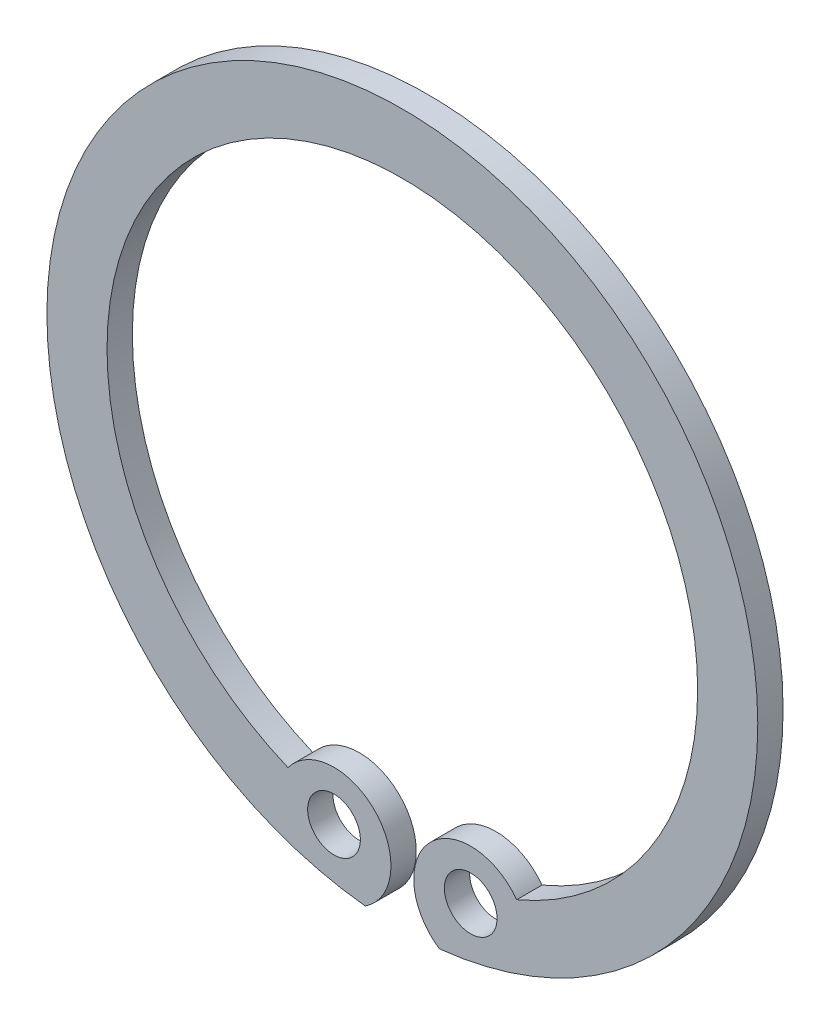
ISO-10303-21;
HEADER;
FILE_DESCRIPTION(('STEP AP214'),'2;1');
FILE_NAME('part.step','',(''),(''),'','','');
FILE_SCHEMA(('AUTOMOTIVE_DESIGN { 1 0 10303 214 1 1 1 1 }'));
ENDSEC;
DATA;
#1=APPLICATION_CONTEXT('core data for automotive mechanical design processes');
#2=APPLICATION_PROTOCOL_DEFINITION('international standard','automotive_design',2000,#1);
#3=PRODUCT_CONTEXT('',#1,'mechanical');
#4=PRODUCT('Part','Part','',(#3));
#5=PRODUCT_RELATED_PRODUCT_CATEGORY('part','',(#4));
#6=PRODUCT_DEFINITION_FORMATION('','',#4);
#7=PRODUCT_DEFINITION_CONTEXT('part definition',#1,'design');
#8=PRODUCT_DEFINITION('design','',#6,#7);
#9=PRODUCT_DEFINITION_SHAPE('','',#8);
#10=(LENGTH_UNIT() NAMED_UNIT(*) SI_UNIT(.MILLI.,.METRE.));
#11=(NAMED_UNIT(*) PLANE_ANGLE_UNIT() SI_UNIT($,.RADIAN.));
#12=(NAMED_UNIT(*) SI_UNIT($,.STERADIAN.) SOLID_ANGLE_UNIT());
#13=UNCERTAINTY_MEASURE_WITH_UNIT(LENGTH_MEASURE(1.E-05),#10,'distance_accuracy_value','');
#14=(GEOMETRIC_REPRESENTATION_CONTEXT(3) GLOBAL_UNCERTAINTY_ASSIGNED_CONTEXT((#13)) GLOBAL_UNIT_ASSIGNED_CONTEXT((#10,
#11,#12)) REPRESENTATION_CONTEXT('',''));
#15=CARTESIAN_POINT('',(0.,0.,0.));
#16=DIRECTION('',(0.,0.,1.));
#17=DIRECTION('',(1.,0.,0.));
#18=AXIS2_PLACEMENT_3D('',#15,#16,#17);
#19=CARTESIAN_POINT('',(3.24,-14.15,0.6));
#20=DIRECTION('',(0.,0.,-1.));
#21=DIRECTION('',(1.,0.,0.));
#22=AXIS2_PLACEMENT_3D('',#19,#20,#21);
#23=CYLINDRICAL_SURFACE('',#22,1.25);
#24=CARTESIAN_POINT('',(3.24,-14.15,1.2));
#25=DIRECTION('',(0.,0.,-1.));
#26=DIRECTION('',(1.,0.,0.));
#27=AXIS2_PLACEMENT_3D('',#24,#25,#26);
#28=CIRCLE('',#27,1.25);
#29=CARTESIAN_POINT('',(1.99,-14.15,1.2));
#30=VERTEX_POINT('',#29);
#31=EDGE_CURVE('E32',#30,#30,#28,.T.);
#32=ORIENTED_EDGE('',*,*,#31,.F.);
#33=EDGE_LOOP('',(#32));
#34=FACE_BOUND('',#33,.T.);
#35=CARTESIAN_POINT('',(3.24,-14.15,0.));
#36=DIRECTION('',(0.,0.,1.));
#37=DIRECTION('',(1.,0.,0.));
#38=AXIS2_PLACEMENT_3D('',#35,#36,#37);
#39=CIRCLE('',#38,1.25);
#40=CARTESIAN_POINT('',(1.99,-14.15,0.));
#41=VERTEX_POINT('',#40);
#42=EDGE_CURVE('E9',#41,#41,#39,.T.);
#43=ORIENTED_EDGE('',*,*,#42,.F.);
#44=EDGE_LOOP('',(#43));
#45=FACE_BOUND('',#44,.T.);
#46=ADVANCED_FACE('F15',(#34,#45),#23,.F.);
#47=CARTESIAN_POINT('',(-3.24,-14.15,0.6));
#48=DIRECTION('',(0.,0.,-1.));
#49=DIRECTION('',(1.,0.,0.));
#50=AXIS2_PLACEMENT_3D('',#47,#48,#49);
#51=CYLINDRICAL_SURFACE('',#50,1.25);
#52=CARTESIAN_POINT('',(-3.24,-14.15,1.2));
#53=DIRECTION('',(0.,0.,-1.));
#54=DIRECTION('',(1.,0.,0.));
#55=AXIS2_PLACEMENT_3D('',#52,#53,#54);
#56=CIRCLE('',#55,1.25);
#57=CARTESIAN_POINT('',(-4.49,-14.15,1.2));
#58=VERTEX_POINT('',#57);
#59=EDGE_CURVE('E106',#58,#58,#56,.T.);
#60=ORIENTED_EDGE('',*,*,#59,.F.);
#61=EDGE_LOOP('',(#60));
#62=FACE_BOUND('',#61,.T.);
#63=CARTESIAN_POINT('',(-3.24,-14.15,0.));
#64=DIRECTION('',(0.,0.,1.));
#65=DIRECTION('',(1.,0.,0.));
#66=AXIS2_PLACEMENT_3D('',#63,#64,#65);
#67=CIRCLE('',#66,1.25);
#68=CARTESIAN_POINT('',(-4.49,-14.15,0.));
#69=VERTEX_POINT('',#68);
#70=EDGE_CURVE('E25',#69,#69,#67,.T.);
#71=ORIENTED_EDGE('',*,*,#70,.F.);
#72=EDGE_LOOP('',(#71));
#73=FACE_BOUND('',#72,.T.);
#74=ADVANCED_FACE('F120',(#62,#73),#51,.F.);
#75=CARTESIAN_POINT('',(3.24,-14.5,0.6));
#76=DIRECTION('',(0.,0.,1.));
#77=DIRECTION('',(-1.,0.,0.));
#78=AXIS2_PLACEMENT_3D('',#75,#76,#77);
#79=CYLINDRICAL_SURFACE('',#78,2.7);
#80=DIRECTION('',(0.,0.,1.));
#81=VECTOR('',#80,1.);
#82=CARTESIAN_POINT('',(5.42070486126038,-12.9079804310011,0.6));
#83=LINE('',#82,#81);
#84=CARTESIAN_POINT('',(5.42070486126038,-12.9079804310011,0.));
#85=VERTEX_POINT('',#84);
#86=CARTESIAN_POINT('',(5.42070486126038,-12.9079804310011,1.2));
#87=VERTEX_POINT('',#86);
#88=EDGE_CURVE('E83',#85,#87,#83,.T.);
#89=ORIENTED_EDGE('',*,*,#88,.F.);
#90=CARTESIAN_POINT('',(3.24,-14.5,0.));
#91=DIRECTION('',(0.,0.,-1.));
#92=DIRECTION('',(-1.,0.,0.));
#93=AXIS2_PLACEMENT_3D('',#90,#91,#92);
#94=CIRCLE('',#93,2.7);
#95=CARTESIAN_POINT('',(1.75947618645947,-16.7578860107498,0.));
#96=VERTEX_POINT('',#95);
#97=EDGE_CURVE('E89',#96,#85,#94,.T.);
#98=ORIENTED_EDGE('',*,*,#97,.F.);
#99=DIRECTION('',(0.,0.,-1.));
#100=VECTOR('',#99,1.);
#101=CARTESIAN_POINT('',(1.75947618645945,-16.7578860107498,0.6));
#102=LINE('',#101,#100);
#103=CARTESIAN_POINT('',(1.75947618645947,-16.7578860107498,1.2));
#104=VERTEX_POINT('',#103);
#105=EDGE_CURVE('E95',#104,#96,#102,.T.);
#106=ORIENTED_EDGE('',*,*,#105,.F.);
#107=CARTESIAN_POINT('',(3.24,-14.5,1.2));
#108=DIRECTION('',(0.,0.,1.));
#109=DIRECTION('',(-1.,0.,0.));
#110=AXIS2_PLACEMENT_3D('',#107,#108,#109);
#111=CIRCLE('',#110,2.7);
#112=EDGE_CURVE('E101',#87,#104,#111,.T.);
#113=ORIENTED_EDGE('',*,*,#112,.F.);
#114=EDGE_LOOP('',(#89,#98,#106,#113));
#115=FACE_BOUND('',#114,.T.);
#116=ADVANCED_FACE('F118',(#115),#79,.T.);
#117=CARTESIAN_POINT('',(0.,0.,0.));
#118=DIRECTION('',(0.,0.,-1.));
#119=DIRECTION('',(-1.,0.,0.));
#120=AXIS2_PLACEMENT_3D('',#117,#118,#119);
#121=PLANE('',#120);
#122=ORIENTED_EDGE('',*,*,#42,.T.);
#123=EDGE_LOOP('',(#122));
#124=FACE_BOUND('',#123,.T.);
#125=ORIENTED_EDGE('',*,*,#70,.T.);
#126=EDGE_LOOP('',(#125));
#127=FACE_BOUND('',#126,.T.);
#128=CARTESIAN_POINT('',(0.,0.,0.));
#129=DIRECTION('',(0.,0.,1.));
#130=DIRECTION('',(-1.,0.,0.));
#131=AXIS2_PLACEMENT_3D('',#128,#129,#130);
#132=CIRCLE('',#131,16.85);
#133=CARTESIAN_POINT('',(-1.75947618645947,-16.7578860107498,0.));
#134=VERTEX_POINT('',#133);
#135=EDGE_CURVE('E73',#96,#134,#132,.T.);
#136=ORIENTED_EDGE('',*,*,#135,.F.);
#137=ORIENTED_EDGE('',*,*,#97,.T.);
#138=CARTESIAN_POINT('',(0.,0.,0.));
#139=DIRECTION('',(0.,0.,1.));
#140=DIRECTION('',(1.,0.,0.));
#141=AXIS2_PLACEMENT_3D('',#138,#139,#140);
#142=CIRCLE('',#141,14.);
#143=CARTESIAN_POINT('',(-5.42070486126038,-12.9079804310011,0.));
#144=VERTEX_POINT('',#143);
#145=EDGE_CURVE('E82',#85,#144,#142,.T.);
#146=ORIENTED_EDGE('',*,*,#145,.T.);
#147=CARTESIAN_POINT('',(-3.24,-14.5,0.));
#148=DIRECTION('',(0.,0.,-1.));
#149=DIRECTION('',(1.,0.,0.));
#150=AXIS2_PLACEMENT_3D('',#147,#148,#149);
#151=CIRCLE('',#150,2.7);
#152=EDGE_CURVE('E76',#144,#134,#151,.T.);
#153=ORIENTED_EDGE('',*,*,#152,.T.);
#154=EDGE_LOOP('',(#136,#137,#146,#153));
#155=FACE_BOUND('',#154,.T.);
#156=ADVANCED_FACE('F87',(#124,#127,#155),#121,.T.);
#157=CARTESIAN_POINT('',(0.,0.,-1.2));
#158=DIRECTION('',(0.,0.,-1.));
#159=DIRECTION('',(1.,0.,0.));
#160=AXIS2_PLACEMENT_3D('',#157,#158,#159);
#161=CYLINDRICAL_SURFACE('',#160,14.);
#162=ORIENTED_EDGE('',*,*,#88,.T.);
#163=CARTESIAN_POINT('',(0.,0.,1.2));
#164=DIRECTION('',(0.,0.,-1.));
#165=DIRECTION('',(1.,0.,0.));
#166=AXIS2_PLACEMENT_3D('',#163,#164,#165);
#167=CIRCLE('',#166,14.);
#168=CARTESIAN_POINT('',(-5.42070486126038,-12.9079804310011,1.2));
#169=VERTEX_POINT('',#168);
#170=EDGE_CURVE('E19',#169,#87,#167,.T.);
#171=ORIENTED_EDGE('',*,*,#170,.F.);
#172=DIRECTION('',(0.,0.,-1.));
#173=VECTOR('',#172,1.);
#174=CARTESIAN_POINT('',(-5.42070486126038,-12.9079804310011,0.6));
#175=LINE('',#174,#173);
#176=EDGE_CURVE('E79',#169,#144,#175,.T.);
#177=ORIENTED_EDGE('',*,*,#176,.T.);
#178=ORIENTED_EDGE('',*,*,#145,.F.);
#179=EDGE_LOOP('',(#162,#171,#177,#178));
#180=FACE_BOUND('',#179,.T.);
#181=ADVANCED_FACE('F17',(#180),#161,.F.);
#182=CARTESIAN_POINT('',(-3.24,-14.5,0.6));
#183=DIRECTION('',(0.,0.,-1.));
#184=DIRECTION('',(1.,0.,0.));
#185=AXIS2_PLACEMENT_3D('',#182,#183,#184);
#186=CYLINDRICAL_SURFACE('',#185,2.7);
#187=ORIENTED_EDGE('',*,*,#176,.F.);
#188=CARTESIAN_POINT('',(-3.24,-14.5,1.2));
#189=DIRECTION('',(0.,0.,1.));
#190=DIRECTION('',(1.,0.,0.));
#191=AXIS2_PLACEMENT_3D('',#188,#189,#190);
#192=CIRCLE('',#191,2.7);
#193=CARTESIAN_POINT('',(-1.75947618645947,-16.7578860107498,1.2));
#194=VERTEX_POINT('',#193);
#195=EDGE_CURVE('E61',#194,#169,#192,.T.);
#196=ORIENTED_EDGE('',*,*,#195,.F.);
#197=DIRECTION('',(0.,0.,1.));
#198=VECTOR('',#197,1.);
#199=CARTESIAN_POINT('',(-1.75947618645945,-16.7578860107498,0.6));
#200=LINE('',#199,#198);
#201=EDGE_CURVE('E80',#134,#194,#200,.T.);
#202=ORIENTED_EDGE('',*,*,#201,.F.);
#203=ORIENTED_EDGE('',*,*,#152,.F.);
#204=EDGE_LOOP('',(#187,#196,#202,#203));
#205=FACE_BOUND('',#204,.T.);
#206=ADVANCED_FACE('F78',(#205),#186,.T.);
#207=CARTESIAN_POINT('',(0.,0.,0.6));
#208=DIRECTION('',(0.,0.,-1.));
#209=DIRECTION('',(1.,0.,0.));
#210=AXIS2_PLACEMENT_3D('',#207,#208,#209);
#211=CYLINDRICAL_SURFACE('',#210,16.85);
#212=CARTESIAN_POINT('',(0.,0.,1.2));
#213=DIRECTION('',(0.,0.,-1.));
#214=DIRECTION('',(1.,0.,0.));
#215=AXIS2_PLACEMENT_3D('',#212,#213,#214);
#216=CIRCLE('',#215,16.85);
#217=EDGE_CURVE('E91',#194,#104,#216,.T.);
#218=ORIENTED_EDGE('',*,*,#217,.T.);
#219=ORIENTED_EDGE('',*,*,#105,.T.);
#220=ORIENTED_EDGE('',*,*,#135,.T.);
#221=ORIENTED_EDGE('',*,*,#201,.T.);
#222=EDGE_LOOP('',(#218,#219,#220,#221));
#223=FACE_BOUND('',#222,.T.);
#224=ADVANCED_FACE('F112',(#223),#211,.T.);
#225=CARTESIAN_POINT('',(0.,0.,1.2));
#226=DIRECTION('',(0.,0.,1.));
#227=DIRECTION('',(1.,0.,0.));
#228=AXIS2_PLACEMENT_3D('',#225,#226,#227);
#229=PLANE('',#228);
#230=ORIENTED_EDGE('',*,*,#31,.T.);
#231=EDGE_LOOP('',(#230));
#232=FACE_BOUND('',#231,.T.);
#233=ORIENTED_EDGE('',*,*,#59,.T.);
#234=EDGE_LOOP('',(#233));
#235=FACE_BOUND('',#234,.T.);
#236=ORIENTED_EDGE('',*,*,#170,.T.);
#237=ORIENTED_EDGE('',*,*,#112,.T.);
#238=ORIENTED_EDGE('',*,*,#217,.F.);
#239=ORIENTED_EDGE('',*,*,#195,.T.);
#240=EDGE_LOOP('',(#236,#237,#238,#239));
#241=FACE_BOUND('',#240,.T.);
#242=ADVANCED_FACE('F109',(#232,#235,#241),#229,.T.);
#243=CLOSED_SHELL('',(#46,#74,#116,#156,#181,#206,#224,#242));
#244=MANIFOLD_SOLID_BREP('B1',#243);
#245=ADVANCED_BREP_SHAPE_REPRESENTATION('',(#18,#244),#14);
#246=SHAPE_DEFINITION_REPRESENTATION(#9,#245);
ENDSEC;
END-ISO-10303-21;
